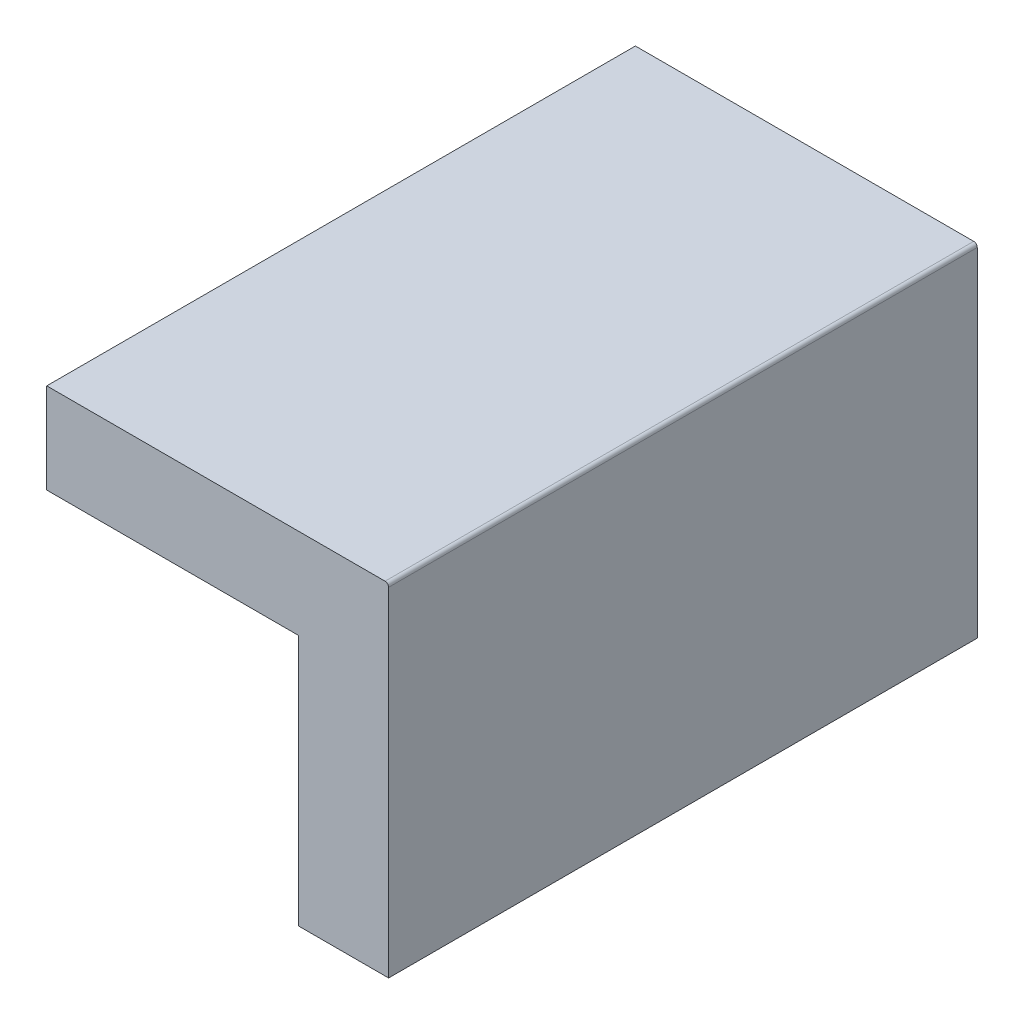
ISO-10303-21;
HEADER;
FILE_DESCRIPTION(('STEP AP214'),'2;1');
FILE_NAME('part.step','',(''),(''),'','','');
FILE_SCHEMA(('AUTOMOTIVE_DESIGN { 1 0 10303 214 1 1 1 1 }'));
ENDSEC;
DATA;
#1=APPLICATION_CONTEXT('core data for automotive mechanical design processes');
#2=APPLICATION_PROTOCOL_DEFINITION('international standard','automotive_design',2000,#1);
#3=PRODUCT_CONTEXT('',#1,'mechanical');
#4=PRODUCT('Part','Part','',(#3));
#5=PRODUCT_RELATED_PRODUCT_CATEGORY('part','',(#4));
#6=PRODUCT_DEFINITION_FORMATION('','',#4);
#7=PRODUCT_DEFINITION_CONTEXT('part definition',#1,'design');
#8=PRODUCT_DEFINITION('design','',#6,#7);
#9=PRODUCT_DEFINITION_SHAPE('','',#8);
#10=(LENGTH_UNIT() NAMED_UNIT(*) SI_UNIT(.MILLI.,.METRE.));
#11=(NAMED_UNIT(*) PLANE_ANGLE_UNIT() SI_UNIT($,.RADIAN.));
#12=(NAMED_UNIT(*) SI_UNIT($,.STERADIAN.) SOLID_ANGLE_UNIT());
#13=UNCERTAINTY_MEASURE_WITH_UNIT(LENGTH_MEASURE(1.E-05),#10,'distance_accuracy_value','');
#14=(GEOMETRIC_REPRESENTATION_CONTEXT(3) GLOBAL_UNCERTAINTY_ASSIGNED_CONTEXT((#13)) GLOBAL_UNIT_ASSIGNED_CONTEXT((#10,
#11,#12)) REPRESENTATION_CONTEXT('',''));
#15=CARTESIAN_POINT('',(0.,0.,0.));
#16=DIRECTION('',(0.,0.,1.));
#17=DIRECTION('',(1.,0.,0.));
#18=AXIS2_PLACEMENT_3D('',#15,#16,#17);
#19=CARTESIAN_POINT('',(0.,0.,304.8));
#20=DIRECTION('',(1.,0.,0.));
#21=DIRECTION('',(0.,1.,0.));
#22=AXIS2_PLACEMENT_3D('',#19,#20,#21);
#23=PLANE('',#22);
#24=DIRECTION('',(0.,0.,-1.));
#25=VECTOR('',#24,1.);
#26=CARTESIAN_POINT('',(0.,-923.925000000009,304.8));
#27=LINE('',#26,#25);
#28=CARTESIAN_POINT('',(0.,-923.925000000009,304.8));
#29=VERTEX_POINT('',#28);
#30=CARTESIAN_POINT('',(0.,-923.925000000009,-1286.002));
#31=VERTEX_POINT('',#30);
#32=EDGE_CURVE('E186',#29,#31,#27,.T.);
#33=ORIENTED_EDGE('',*,*,#32,.T.);
#34=DIRECTION('',(0.,-1.,0.));
#35=VECTOR('',#34,1.);
#36=CARTESIAN_POINT('',(0.,0.,-1286.002));
#37=LINE('',#36,#35);
#38=CARTESIAN_POINT('',(0.,-9.52500000000911,-1286.002));
#39=VERTEX_POINT('',#38);
#40=EDGE_CURVE('E185',#39,#31,#37,.T.);
#41=ORIENTED_EDGE('',*,*,#40,.F.);
#42=DIRECTION('',(0.,0.,-1.));
#43=VECTOR('',#42,1.);
#44=CARTESIAN_POINT('',(0.,-9.52500000000911,304.8));
#45=LINE('',#44,#43);
#46=CARTESIAN_POINT('',(0.,-9.52500000000911,304.8));
#47=VERTEX_POINT('',#46);
#48=EDGE_CURVE('E12',#47,#39,#45,.T.);
#49=ORIENTED_EDGE('',*,*,#48,.F.);
#50=DIRECTION('',(0.,-1.,0.));
#51=VECTOR('',#50,1.);
#52=CARTESIAN_POINT('',(0.,0.,304.8));
#53=LINE('',#52,#51);
#54=EDGE_CURVE('E210',#47,#29,#53,.T.);
#55=ORIENTED_EDGE('',*,*,#54,.T.);
#56=EDGE_LOOP('',(#33,#41,#49,#55));
#57=FACE_BOUND('',#56,.T.);
#58=ADVANCED_FACE('F119',(#57),#23,.T.);
#59=CARTESIAN_POINT('',(-9.52499999998822,-9.52500000000975,304.8));
#60=DIRECTION('',(0.,0.,-1.));
#61=DIRECTION('',(-1.,0.,0.));
#62=AXIS2_PLACEMENT_3D('',#59,#60,#61);
#63=CYLINDRICAL_SURFACE('',#62,9.52499999999417);
#64=ORIENTED_EDGE('',*,*,#48,.T.);
#65=CARTESIAN_POINT('',(-9.52499999998822,-9.52500000000975,-1286.002));
#66=DIRECTION('',(0.,0.,1.));
#67=DIRECTION('',(1.,0.,0.));
#68=AXIS2_PLACEMENT_3D('',#65,#66,#67);
#69=CIRCLE('',#68,9.52499999999417);
#70=CARTESIAN_POINT('',(-9.52499999998822,1.00369057376956E-13,-1286.002));
#71=VERTEX_POINT('',#70);
#72=EDGE_CURVE('E180',#39,#71,#69,.T.);
#73=ORIENTED_EDGE('',*,*,#72,.T.);
#74=DIRECTION('',(0.,0.,-1.));
#75=VECTOR('',#74,1.);
#76=CARTESIAN_POINT('',(-9.52499999998822,1.00369057376956E-13,304.8));
#77=LINE('',#76,#75);
#78=CARTESIAN_POINT('',(-9.52499999998822,1.00369057376956E-13,304.8));
#79=VERTEX_POINT('',#78);
#80=EDGE_CURVE('E126',#79,#71,#77,.T.);
#81=ORIENTED_EDGE('',*,*,#80,.F.);
#82=CARTESIAN_POINT('',(-9.52499999998822,-9.52500000000975,304.8));
#83=DIRECTION('',(0.,0.,1.));
#84=DIRECTION('',(1.,0.,0.));
#85=AXIS2_PLACEMENT_3D('',#82,#83,#84);
#86=CIRCLE('',#85,9.52499999999417);
#87=EDGE_CURVE('E181',#47,#79,#86,.T.);
#88=ORIENTED_EDGE('',*,*,#87,.F.);
#89=EDGE_LOOP('',(#64,#73,#81,#88));
#90=FACE_BOUND('',#89,.T.);
#91=ADVANCED_FACE('F177',(#90),#63,.T.);
#92=CARTESIAN_POINT('',(0.,0.,304.8));
#93=DIRECTION('',(0.,-1.,0.));
#94=DIRECTION('',(1.,0.,0.));
#95=AXIS2_PLACEMENT_3D('',#92,#93,#94);
#96=PLANE('',#95);
#97=ORIENTED_EDGE('',*,*,#80,.T.);
#98=DIRECTION('',(-1.,0.,0.));
#99=VECTOR('',#98,1.);
#100=CARTESIAN_POINT('',(0.,0.,-1286.002));
#101=LINE('',#100,#99);
#102=CARTESIAN_POINT('',(-923.924999999988,9.7357985655766E-12,-1286.002));
#103=VERTEX_POINT('',#102);
#104=EDGE_CURVE('E195',#71,#103,#101,.T.);
#105=ORIENTED_EDGE('',*,*,#104,.T.);
#106=DIRECTION('',(0.,0.,-1.));
#107=VECTOR('',#106,1.);
#108=CARTESIAN_POINT('',(-923.924999999988,9.7357985655766E-12,304.8));
#109=LINE('',#108,#107);
#110=CARTESIAN_POINT('',(-923.924999999988,9.7357985655766E-12,304.8));
#111=VERTEX_POINT('',#110);
#112=EDGE_CURVE('E228',#111,#103,#109,.T.);
#113=ORIENTED_EDGE('',*,*,#112,.F.);
#114=DIRECTION('',(-1.,0.,0.));
#115=VECTOR('',#114,1.);
#116=CARTESIAN_POINT('',(0.,0.,304.8));
#117=LINE('',#116,#115);
#118=EDGE_CURVE('E213',#79,#111,#117,.T.);
#119=ORIENTED_EDGE('',*,*,#118,.F.);
#120=EDGE_LOOP('',(#97,#105,#113,#119));
#121=FACE_BOUND('',#120,.T.);
#122=ADVANCED_FACE('F231',(#121),#96,.F.);
#123=CARTESIAN_POINT('',(-923.924999999988,-4.20501222808948E-13,304.8));
#124=DIRECTION('',(1.,0.,0.));
#125=DIRECTION('',(0.,1.,0.));
#126=AXIS2_PLACEMENT_3D('',#123,#124,#125);
#127=PLANE('',#126);
#128=ORIENTED_EDGE('',*,*,#112,.T.);
#129=DIRECTION('',(0.,-1.,0.));
#130=VECTOR('',#129,1.);
#131=CARTESIAN_POINT('',(-923.924999999988,-4.20501222808948E-13,-1286.002));
#132=LINE('',#131,#130);
#133=CARTESIAN_POINT('',(-923.924999999988,-243.938127260294,-1286.002));
#134=VERTEX_POINT('',#133);
#135=EDGE_CURVE('E197',#103,#134,#132,.T.);
#136=ORIENTED_EDGE('',*,*,#135,.T.);
#137=DIRECTION('',(0.,0.,-1.));
#138=VECTOR('',#137,1.);
#139=CARTESIAN_POINT('',(-923.924999999988,-243.938127260294,304.8));
#140=LINE('',#139,#138);
#141=CARTESIAN_POINT('',(-923.924999999988,-243.938127260294,304.8));
#142=VERTEX_POINT('',#141);
#143=EDGE_CURVE('E226',#142,#134,#140,.T.);
#144=ORIENTED_EDGE('',*,*,#143,.F.);
#145=DIRECTION('',(0.,-1.,0.));
#146=VECTOR('',#145,1.);
#147=CARTESIAN_POINT('',(-923.924999999988,-4.20501222808948E-13,304.8));
#148=LINE('',#147,#146);
#149=EDGE_CURVE('E215',#111,#142,#148,.T.);
#150=ORIENTED_EDGE('',*,*,#149,.F.);
#151=EDGE_LOOP('',(#128,#136,#144,#150));
#152=FACE_BOUND('',#151,.T.);
#153=ADVANCED_FACE('F239',(#152),#127,.F.);
#154=CARTESIAN_POINT('',(0.,-243.938127260294,304.8));
#155=DIRECTION('',(0.,1.,0.));
#156=DIRECTION('',(0.,0.,1.));
#157=AXIS2_PLACEMENT_3D('',#154,#155,#156);
#158=PLANE('',#157);
#159=ORIENTED_EDGE('',*,*,#143,.T.);
#160=DIRECTION('',(1.,0.,0.));
#161=VECTOR('',#160,1.);
#162=CARTESIAN_POINT('',(0.,-243.938127260294,-1286.002));
#163=LINE('',#162,#161);
#164=CARTESIAN_POINT('',(-243.938127260294,-243.938127260294,-1286.002));
#165=VERTEX_POINT('',#164);
#166=EDGE_CURVE('E202',#134,#165,#163,.T.);
#167=ORIENTED_EDGE('',*,*,#166,.T.);
#168=DIRECTION('',(0.,0.,-1.));
#169=VECTOR('',#168,1.);
#170=CARTESIAN_POINT('',(-243.938127260294,-243.938127260294,304.8));
#171=LINE('',#170,#169);
#172=CARTESIAN_POINT('',(-243.938127260294,-243.938127260294,304.8));
#173=VERTEX_POINT('',#172);
#174=EDGE_CURVE('E224',#173,#165,#171,.T.);
#175=ORIENTED_EDGE('',*,*,#174,.F.);
#176=DIRECTION('',(1.,0.,0.));
#177=VECTOR('',#176,1.);
#178=CARTESIAN_POINT('',(0.,-243.938127260294,304.8));
#179=LINE('',#178,#177);
#180=EDGE_CURVE('E217',#142,#173,#179,.T.);
#181=ORIENTED_EDGE('',*,*,#180,.F.);
#182=EDGE_LOOP('',(#159,#167,#175,#181));
#183=FACE_BOUND('',#182,.T.);
#184=ADVANCED_FACE('F242',(#183),#158,.F.);
#185=CARTESIAN_POINT('',(-243.938127260294,0.,304.8));
#186=DIRECTION('',(1.,0.,0.));
#187=DIRECTION('',(0.,1.,0.));
#188=AXIS2_PLACEMENT_3D('',#185,#186,#187);
#189=PLANE('',#188);
#190=ORIENTED_EDGE('',*,*,#174,.T.);
#191=DIRECTION('',(0.,-1.,0.));
#192=VECTOR('',#191,1.);
#193=CARTESIAN_POINT('',(-243.938127260294,0.,-1286.002));
#194=LINE('',#193,#192);
#195=CARTESIAN_POINT('',(-243.938127260294,-923.925000000009,-1286.002));
#196=VERTEX_POINT('',#195);
#197=EDGE_CURVE('E205',#165,#196,#194,.T.);
#198=ORIENTED_EDGE('',*,*,#197,.T.);
#199=DIRECTION('',(0.,0.,-1.));
#200=VECTOR('',#199,1.);
#201=CARTESIAN_POINT('',(-243.938127260294,-923.925000000009,304.8));
#202=LINE('',#201,#200);
#203=CARTESIAN_POINT('',(-243.938127260294,-923.925000000009,304.8));
#204=VERTEX_POINT('',#203);
#205=EDGE_CURVE('E222',#204,#196,#202,.T.);
#206=ORIENTED_EDGE('',*,*,#205,.F.);
#207=DIRECTION('',(0.,-1.,0.));
#208=VECTOR('',#207,1.);
#209=CARTESIAN_POINT('',(-243.938127260294,0.,304.8));
#210=LINE('',#209,#208);
#211=EDGE_CURVE('E138',#173,#204,#210,.T.);
#212=ORIENTED_EDGE('',*,*,#211,.F.);
#213=EDGE_LOOP('',(#190,#198,#206,#212));
#214=FACE_BOUND('',#213,.T.);
#215=ADVANCED_FACE('F245',(#214),#189,.F.);
#216=CARTESIAN_POINT('',(0.,-923.925000000009,304.8));
#217=DIRECTION('',(0.,1.,0.));
#218=DIRECTION('',(0.,0.,1.));
#219=AXIS2_PLACEMENT_3D('',#216,#217,#218);
#220=PLANE('',#219);
#221=ORIENTED_EDGE('',*,*,#205,.T.);
#222=DIRECTION('',(1.,0.,0.));
#223=VECTOR('',#222,1.);
#224=CARTESIAN_POINT('',(0.,-923.925000000009,-1286.002));
#225=LINE('',#224,#223);
#226=EDGE_CURVE('E208',#196,#31,#225,.T.);
#227=ORIENTED_EDGE('',*,*,#226,.T.);
#228=ORIENTED_EDGE('',*,*,#32,.F.);
#229=DIRECTION('',(1.,0.,0.));
#230=VECTOR('',#229,1.);
#231=CARTESIAN_POINT('',(0.,-923.925000000009,304.8));
#232=LINE('',#231,#230);
#233=EDGE_CURVE('E133',#204,#29,#232,.T.);
#234=ORIENTED_EDGE('',*,*,#233,.F.);
#235=EDGE_LOOP('',(#221,#227,#228,#234));
#236=FACE_BOUND('',#235,.T.);
#237=ADVANCED_FACE('F247',(#236),#220,.F.);
#238=CARTESIAN_POINT('',(0.,0.,304.8));
#239=DIRECTION('',(0.,0.,1.));
#240=DIRECTION('',(1.,0.,0.));
#241=AXIS2_PLACEMENT_3D('',#238,#239,#240);
#242=PLANE('',#241);
#243=ORIENTED_EDGE('',*,*,#54,.F.);
#244=ORIENTED_EDGE('',*,*,#87,.T.);
#245=ORIENTED_EDGE('',*,*,#118,.T.);
#246=ORIENTED_EDGE('',*,*,#149,.T.);
#247=ORIENTED_EDGE('',*,*,#180,.T.);
#248=ORIENTED_EDGE('',*,*,#211,.T.);
#249=ORIENTED_EDGE('',*,*,#233,.T.);
#250=EDGE_LOOP('',(#243,#244,#245,#246,#247,#248,#249));
#251=FACE_BOUND('',#250,.T.);
#252=ADVANCED_FACE('F234',(#251),#242,.T.);
#253=CARTESIAN_POINT('',(0.,0.,-1286.002));
#254=DIRECTION('',(0.,0.,1.));
#255=DIRECTION('',(1.,0.,0.));
#256=AXIS2_PLACEMENT_3D('',#253,#254,#255);
#257=PLANE('',#256);
#258=ORIENTED_EDGE('',*,*,#40,.T.);
#259=ORIENTED_EDGE('',*,*,#226,.F.);
#260=ORIENTED_EDGE('',*,*,#197,.F.);
#261=ORIENTED_EDGE('',*,*,#166,.F.);
#262=ORIENTED_EDGE('',*,*,#135,.F.);
#263=ORIENTED_EDGE('',*,*,#104,.F.);
#264=ORIENTED_EDGE('',*,*,#72,.F.);
#265=EDGE_LOOP('',(#258,#259,#260,#261,#262,#263,#264));
#266=FACE_BOUND('',#265,.T.);
#267=ADVANCED_FACE('F192',(#266),#257,.F.);
#268=CLOSED_SHELL('',(#58,#91,#122,#153,#184,#215,#237,#252,#267));
#269=MANIFOLD_SOLID_BREP('B2',#268);
#270=ADVANCED_BREP_SHAPE_REPRESENTATION('',(#18,#269),#14);
#271=SHAPE_DEFINITION_REPRESENTATION(#9,#270);
ENDSEC;
END-ISO-10303-21;
